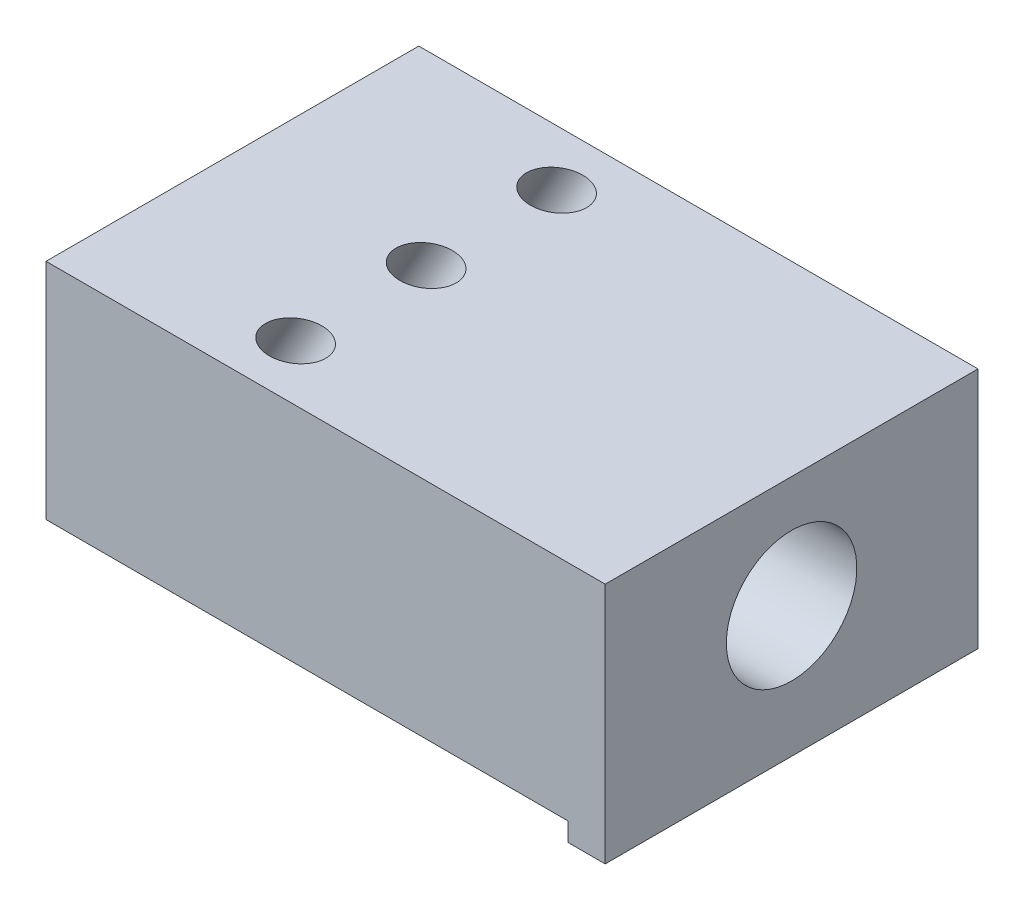
ISO-10303-21;
HEADER;
FILE_DESCRIPTION(('STEP AP214'),'2;1');
FILE_NAME('part.step','',(''),(''),'','','');
FILE_SCHEMA(('AUTOMOTIVE_DESIGN { 1 0 10303 214 1 1 1 1 }'));
ENDSEC;
DATA;
#1=APPLICATION_CONTEXT('core data for automotive mechanical design processes');
#2=APPLICATION_PROTOCOL_DEFINITION('international standard','automotive_design',2000,#1);
#3=PRODUCT_CONTEXT('',#1,'mechanical');
#4=PRODUCT('Part','Part','',(#3));
#5=PRODUCT_RELATED_PRODUCT_CATEGORY('part','',(#4));
#6=PRODUCT_DEFINITION_FORMATION('','',#4);
#7=PRODUCT_DEFINITION_CONTEXT('part definition',#1,'design');
#8=PRODUCT_DEFINITION('design','',#6,#7);
#9=PRODUCT_DEFINITION_SHAPE('','',#8);
#10=(LENGTH_UNIT() NAMED_UNIT(*) SI_UNIT(.MILLI.,.METRE.));
#11=(NAMED_UNIT(*) PLANE_ANGLE_UNIT() SI_UNIT($,.RADIAN.));
#12=(NAMED_UNIT(*) SI_UNIT($,.STERADIAN.) SOLID_ANGLE_UNIT());
#13=UNCERTAINTY_MEASURE_WITH_UNIT(LENGTH_MEASURE(1.E-05),#10,'distance_accuracy_value','');
#14=(GEOMETRIC_REPRESENTATION_CONTEXT(3) GLOBAL_UNCERTAINTY_ASSIGNED_CONTEXT((#13)) GLOBAL_UNIT_ASSIGNED_CONTEXT((#10,
#11,#12)) REPRESENTATION_CONTEXT('',''));
#15=CARTESIAN_POINT('',(0.,0.,0.));
#16=DIRECTION('',(0.,0.,1.));
#17=DIRECTION('',(1.,0.,0.));
#18=AXIS2_PLACEMENT_3D('',#15,#16,#17);
#19=CARTESIAN_POINT('',(0.,0.,20.));
#20=DIRECTION('',(0.,1.,0.));
#21=DIRECTION('',(-1.,0.,0.));
#22=AXIS2_PLACEMENT_3D('',#19,#20,#21);
#23=PLANE('',#22);
#24=CARTESIAN_POINT('',(3.46410161513776,0.,3.));
#25=DIRECTION('',(0.,1.,0.));
#26=DIRECTION('',(-1.,0.,0.));
#27=AXIS2_PLACEMENT_3D('',#24,#25,#26);
#28=ELLIPSE('',#27,1.61658075373095,1.4);
#29=CARTESIAN_POINT('',(1.84752086140681,0.,3.));
#30=VERTEX_POINT('',#29);
#31=EDGE_CURVE('E216',#30,#30,#28,.T.);
#32=ORIENTED_EDGE('',*,*,#31,.T.);
#33=EDGE_LOOP('',(#32));
#34=FACE_BOUND('',#33,.T.);
#35=CARTESIAN_POINT('',(3.46410161513776,0.,17.));
#36=DIRECTION('',(0.,1.,0.));
#37=DIRECTION('',(-1.,0.,0.));
#38=AXIS2_PLACEMENT_3D('',#35,#36,#37);
#39=ELLIPSE('',#38,1.61658075373095,1.4);
#40=CARTESIAN_POINT('',(1.84752086140681,0.,17.));
#41=VERTEX_POINT('',#40);
#42=EDGE_CURVE('E220',#41,#41,#39,.T.);
#43=ORIENTED_EDGE('',*,*,#42,.T.);
#44=EDGE_LOOP('',(#43));
#45=FACE_BOUND('',#44,.T.);
#46=CARTESIAN_POINT('',(3.46410161513776,0.,10.));
#47=DIRECTION('',(0.,1.,0.));
#48=DIRECTION('',(-1.,0.,0.));
#49=AXIS2_PLACEMENT_3D('',#46,#47,#48);
#50=ELLIPSE('',#49,1.61658075373095,1.4);
#51=CARTESIAN_POINT('',(1.8475208614068,0.,10.));
#52=VERTEX_POINT('',#51);
#53=EDGE_CURVE('E223',#52,#52,#50,.T.);
#54=ORIENTED_EDGE('',*,*,#53,.T.);
#55=EDGE_LOOP('',(#54));
#56=FACE_BOUND('',#55,.T.);
#57=DIRECTION('',(1.,0.,0.));
#58=VECTOR('',#57,1.);
#59=CARTESIAN_POINT('',(0.,0.,0.));
#60=LINE('',#59,#58);
#61=CARTESIAN_POINT('',(0.,0.,0.));
#62=VERTEX_POINT('',#61);
#63=CARTESIAN_POINT('',(28.,0.,0.));
#64=VERTEX_POINT('',#63);
#65=EDGE_CURVE('E138',#62,#64,#60,.T.);
#66=ORIENTED_EDGE('',*,*,#65,.T.);
#67=DIRECTION('',(0.,0.,-1.));
#68=VECTOR('',#67,1.);
#69=CARTESIAN_POINT('',(28.,0.,20.));
#70=LINE('',#69,#68);
#71=CARTESIAN_POINT('',(28.,0.,20.));
#72=VERTEX_POINT('',#71);
#73=EDGE_CURVE('E11',#72,#64,#70,.T.);
#74=ORIENTED_EDGE('',*,*,#73,.F.);
#75=DIRECTION('',(1.,0.,0.));
#76=VECTOR('',#75,1.);
#77=CARTESIAN_POINT('',(0.,0.,20.));
#78=LINE('',#77,#76);
#79=CARTESIAN_POINT('',(0.,0.,20.));
#80=VERTEX_POINT('',#79);
#81=EDGE_CURVE('E159',#80,#72,#78,.T.);
#82=ORIENTED_EDGE('',*,*,#81,.F.);
#83=DIRECTION('',(0.,0.,-1.));
#84=VECTOR('',#83,1.);
#85=CARTESIAN_POINT('',(0.,0.,20.));
#86=LINE('',#85,#84);
#87=EDGE_CURVE('E66',#80,#62,#86,.T.);
#88=ORIENTED_EDGE('',*,*,#87,.T.);
#89=EDGE_LOOP('',(#66,#74,#82,#88));
#90=FACE_BOUND('',#89,.T.);
#91=ADVANCED_FACE('F47',(#34,#45,#56,#90),#23,.F.);
#92=CARTESIAN_POINT('',(28.,0.,20.));
#93=DIRECTION('',(1.,0.,0.));
#94=DIRECTION('',(0.,0.,-1.));
#95=AXIS2_PLACEMENT_3D('',#92,#93,#94);
#96=PLANE('',#95);
#97=DIRECTION('',(0.,-1.,0.));
#98=VECTOR('',#97,1.);
#99=CARTESIAN_POINT('',(28.,0.,0.));
#100=LINE('',#99,#98);
#101=CARTESIAN_POINT('',(28.,-0.999999999999999,0.));
#102=VERTEX_POINT('',#101);
#103=EDGE_CURVE('E141',#64,#102,#100,.T.);
#104=ORIENTED_EDGE('',*,*,#103,.T.);
#105=DIRECTION('',(0.,0.,-1.));
#106=VECTOR('',#105,1.);
#107=CARTESIAN_POINT('',(28.,-0.999999999999999,20.));
#108=LINE('',#107,#106);
#109=CARTESIAN_POINT('',(28.,-0.999999999999999,20.));
#110=VERTEX_POINT('',#109);
#111=EDGE_CURVE('E57',#110,#102,#108,.T.);
#112=ORIENTED_EDGE('',*,*,#111,.F.);
#113=DIRECTION('',(0.,-1.,0.));
#114=VECTOR('',#113,1.);
#115=CARTESIAN_POINT('',(28.,0.,20.));
#116=LINE('',#115,#114);
#117=EDGE_CURVE('E98',#72,#110,#116,.T.);
#118=ORIENTED_EDGE('',*,*,#117,.F.);
#119=ORIENTED_EDGE('',*,*,#73,.T.);
#120=EDGE_LOOP('',(#104,#112,#118,#119));
#121=FACE_BOUND('',#120,.T.);
#122=ADVANCED_FACE('F205',(#121),#96,.F.);
#123=CARTESIAN_POINT('',(0.,-1.00000000000001,20.));
#124=DIRECTION('',(0.,-1.,0.));
#125=DIRECTION('',(1.,0.,0.));
#126=AXIS2_PLACEMENT_3D('',#123,#124,#125);
#127=PLANE('',#126);
#128=DIRECTION('',(-1.,0.,0.));
#129=VECTOR('',#128,1.);
#130=CARTESIAN_POINT('',(0.,-1.00000000000001,0.));
#131=LINE('',#130,#129);
#132=CARTESIAN_POINT('',(30.,-0.999999999999999,0.));
#133=VERTEX_POINT('',#132);
#134=EDGE_CURVE('E146',#133,#102,#131,.T.);
#135=ORIENTED_EDGE('',*,*,#134,.F.);
#136=DIRECTION('',(0.,0.,-1.));
#137=VECTOR('',#136,1.);
#138=CARTESIAN_POINT('',(30.,-0.999999999999999,20.));
#139=LINE('',#138,#137);
#140=CARTESIAN_POINT('',(30.,-0.999999999999999,20.));
#141=VERTEX_POINT('',#140);
#142=EDGE_CURVE('E128',#141,#133,#139,.T.);
#143=ORIENTED_EDGE('',*,*,#142,.F.);
#144=DIRECTION('',(-1.,0.,0.));
#145=VECTOR('',#144,1.);
#146=CARTESIAN_POINT('',(0.,-1.00000000000001,20.));
#147=LINE('',#146,#145);
#148=EDGE_CURVE('E116',#141,#110,#147,.T.);
#149=ORIENTED_EDGE('',*,*,#148,.T.);
#150=ORIENTED_EDGE('',*,*,#111,.T.);
#151=EDGE_LOOP('',(#135,#143,#149,#150));
#152=FACE_BOUND('',#151,.T.);
#153=ADVANCED_FACE('F212',(#152),#127,.T.);
#154=CARTESIAN_POINT('',(30.,0.,20.));
#155=DIRECTION('',(-1.,0.,0.));
#156=DIRECTION('',(0.,0.,1.));
#157=AXIS2_PLACEMENT_3D('',#154,#155,#156);
#158=PLANE('',#157);
#159=CARTESIAN_POINT('',(30.,6.,10.));
#160=DIRECTION('',(-1.,0.,0.));
#161=DIRECTION('',(0.,0.,1.));
#162=AXIS2_PLACEMENT_3D('',#159,#160,#161);
#163=CIRCLE('',#162,3.5);
#164=CARTESIAN_POINT('',(30.,6.,13.5));
#165=VERTEX_POINT('',#164);
#166=EDGE_CURVE('E142',#165,#165,#163,.T.);
#167=ORIENTED_EDGE('',*,*,#166,.T.);
#168=EDGE_LOOP('',(#167));
#169=FACE_BOUND('',#168,.T.);
#170=DIRECTION('',(0.,1.,0.));
#171=VECTOR('',#170,1.);
#172=CARTESIAN_POINT('',(30.,0.,0.));
#173=LINE('',#172,#171);
#174=CARTESIAN_POINT('',(30.,12.,0.));
#175=VERTEX_POINT('',#174);
#176=EDGE_CURVE('E124',#133,#175,#173,.T.);
#177=ORIENTED_EDGE('',*,*,#176,.T.);
#178=DIRECTION('',(0.,0.,-1.));
#179=VECTOR('',#178,1.);
#180=CARTESIAN_POINT('',(30.,12.,20.));
#181=LINE('',#180,#179);
#182=CARTESIAN_POINT('',(30.,12.,20.));
#183=VERTEX_POINT('',#182);
#184=EDGE_CURVE('E121',#183,#175,#181,.T.);
#185=ORIENTED_EDGE('',*,*,#184,.F.);
#186=DIRECTION('',(0.,1.,0.));
#187=VECTOR('',#186,1.);
#188=CARTESIAN_POINT('',(30.,0.,20.));
#189=LINE('',#188,#187);
#190=EDGE_CURVE('E109',#141,#183,#189,.T.);
#191=ORIENTED_EDGE('',*,*,#190,.F.);
#192=ORIENTED_EDGE('',*,*,#142,.T.);
#193=EDGE_LOOP('',(#177,#185,#191,#192));
#194=FACE_BOUND('',#193,.T.);
#195=ADVANCED_FACE('F122',(#169,#194),#158,.F.);
#196=CARTESIAN_POINT('',(0.,12.,20.));
#197=DIRECTION('',(0.,1.,0.));
#198=DIRECTION('',(0.,0.,1.));
#199=AXIS2_PLACEMENT_3D('',#196,#197,#198);
#200=PLANE('',#199);
#201=CARTESIAN_POINT('',(10.3923048454133,12.,3.));
#202=DIRECTION('',(0.,1.,0.));
#203=DIRECTION('',(-1.,0.,0.));
#204=AXIS2_PLACEMENT_3D('',#201,#202,#203);
#205=ELLIPSE('',#204,1.61658075373095,1.4);
#206=CARTESIAN_POINT('',(8.77572409168233,12.,3.));
#207=VERTEX_POINT('',#206);
#208=EDGE_CURVE('E50',#207,#207,#205,.T.);
#209=ORIENTED_EDGE('',*,*,#208,.F.);
#210=EDGE_LOOP('',(#209));
#211=FACE_BOUND('',#210,.T.);
#212=CARTESIAN_POINT('',(10.3923048454133,12.,17.));
#213=DIRECTION('',(0.,1.,0.));
#214=DIRECTION('',(-1.,0.,0.));
#215=AXIS2_PLACEMENT_3D('',#212,#213,#214);
#216=ELLIPSE('',#215,1.61658075373095,1.4);
#217=CARTESIAN_POINT('',(8.77572409168233,12.,17.));
#218=VERTEX_POINT('',#217);
#219=EDGE_CURVE('E263',#218,#218,#216,.T.);
#220=ORIENTED_EDGE('',*,*,#219,.F.);
#221=EDGE_LOOP('',(#220));
#222=FACE_BOUND('',#221,.T.);
#223=CARTESIAN_POINT('',(10.3923048454133,12.,10.));
#224=DIRECTION('',(0.,1.,0.));
#225=DIRECTION('',(-1.,0.,0.));
#226=AXIS2_PLACEMENT_3D('',#223,#224,#225);
#227=ELLIPSE('',#226,1.61658075373095,1.4);
#228=CARTESIAN_POINT('',(8.77572409168233,12.,10.));
#229=VERTEX_POINT('',#228);
#230=EDGE_CURVE('E266',#229,#229,#227,.T.);
#231=ORIENTED_EDGE('',*,*,#230,.F.);
#232=EDGE_LOOP('',(#231));
#233=FACE_BOUND('',#232,.T.);
#234=DIRECTION('',(1.,0.,0.));
#235=VECTOR('',#234,1.);
#236=CARTESIAN_POINT('',(0.,12.,0.));
#237=LINE('',#236,#235);
#238=CARTESIAN_POINT('',(0.,12.,0.));
#239=VERTEX_POINT('',#238);
#240=EDGE_CURVE('E152',#239,#175,#237,.T.);
#241=ORIENTED_EDGE('',*,*,#240,.F.);
#242=DIRECTION('',(0.,0.,-1.));
#243=VECTOR('',#242,1.);
#244=CARTESIAN_POINT('',(0.,12.,20.));
#245=LINE('',#244,#243);
#246=CARTESIAN_POINT('',(0.,12.,20.));
#247=VERTEX_POINT('',#246);
#248=EDGE_CURVE('E86',#247,#239,#245,.T.);
#249=ORIENTED_EDGE('',*,*,#248,.F.);
#250=DIRECTION('',(1.,0.,0.));
#251=VECTOR('',#250,1.);
#252=CARTESIAN_POINT('',(0.,12.,20.));
#253=LINE('',#252,#251);
#254=EDGE_CURVE('E114',#247,#183,#253,.T.);
#255=ORIENTED_EDGE('',*,*,#254,.T.);
#256=ORIENTED_EDGE('',*,*,#184,.T.);
#257=EDGE_LOOP('',(#241,#249,#255,#256));
#258=FACE_BOUND('',#257,.T.);
#259=ADVANCED_FACE('F130',(#211,#222,#233,#258),#200,.T.);
#260=CARTESIAN_POINT('',(0.,0.,20.));
#261=DIRECTION('',(-1.,0.,0.));
#262=DIRECTION('',(0.,0.,1.));
#263=AXIS2_PLACEMENT_3D('',#260,#261,#262);
#264=PLANE('',#263);
#265=CARTESIAN_POINT('',(0.,6.,10.));
#266=DIRECTION('',(-1.,0.,0.));
#267=DIRECTION('',(0.,0.,1.));
#268=AXIS2_PLACEMENT_3D('',#265,#266,#267);
#269=CIRCLE('',#268,3.5);
#270=CARTESIAN_POINT('',(0.,6.,13.5));
#271=VERTEX_POINT('',#270);
#272=EDGE_CURVE('E255',#271,#271,#269,.T.);
#273=ORIENTED_EDGE('',*,*,#272,.F.);
#274=EDGE_LOOP('',(#273));
#275=FACE_BOUND('',#274,.T.);
#276=DIRECTION('',(0.,1.,0.));
#277=VECTOR('',#276,1.);
#278=CARTESIAN_POINT('',(0.,0.,0.));
#279=LINE('',#278,#277);
#280=EDGE_CURVE('E155',#62,#239,#279,.T.);
#281=ORIENTED_EDGE('',*,*,#280,.F.);
#282=ORIENTED_EDGE('',*,*,#87,.F.);
#283=DIRECTION('',(0.,1.,0.));
#284=VECTOR('',#283,1.);
#285=CARTESIAN_POINT('',(0.,0.,20.));
#286=LINE('',#285,#284);
#287=EDGE_CURVE('E132',#80,#247,#286,.T.);
#288=ORIENTED_EDGE('',*,*,#287,.T.);
#289=ORIENTED_EDGE('',*,*,#248,.T.);
#290=EDGE_LOOP('',(#281,#282,#288,#289));
#291=FACE_BOUND('',#290,.T.);
#292=ADVANCED_FACE('F227',(#275,#291),#264,.T.);
#293=CARTESIAN_POINT('',(0.,0.,20.));
#294=DIRECTION('',(0.,0.,1.));
#295=DIRECTION('',(1.,0.,0.));
#296=AXIS2_PLACEMENT_3D('',#293,#294,#295);
#297=PLANE('',#296);
#298=ORIENTED_EDGE('',*,*,#81,.T.);
#299=ORIENTED_EDGE('',*,*,#117,.T.);
#300=ORIENTED_EDGE('',*,*,#148,.F.);
#301=ORIENTED_EDGE('',*,*,#190,.T.);
#302=ORIENTED_EDGE('',*,*,#254,.F.);
#303=ORIENTED_EDGE('',*,*,#287,.F.);
#304=EDGE_LOOP('',(#298,#299,#300,#301,#302,#303));
#305=FACE_BOUND('',#304,.T.);
#306=ADVANCED_FACE('F111',(#305),#297,.T.);
#307=CARTESIAN_POINT('',(0.,0.,0.));
#308=DIRECTION('',(0.,0.,1.));
#309=DIRECTION('',(1.,0.,0.));
#310=AXIS2_PLACEMENT_3D('',#307,#308,#309);
#311=PLANE('',#310);
#312=ORIENTED_EDGE('',*,*,#65,.F.);
#313=ORIENTED_EDGE('',*,*,#280,.T.);
#314=ORIENTED_EDGE('',*,*,#240,.T.);
#315=ORIENTED_EDGE('',*,*,#176,.F.);
#316=ORIENTED_EDGE('',*,*,#134,.T.);
#317=ORIENTED_EDGE('',*,*,#103,.F.);
#318=EDGE_LOOP('',(#312,#313,#314,#315,#316,#317));
#319=FACE_BOUND('',#318,.T.);
#320=ADVANCED_FACE('F226',(#319),#311,.F.);
#321=CARTESIAN_POINT('',(34.,6.,10.));
#322=DIRECTION('',(-1.,0.,0.));
#323=DIRECTION('',(0.,0.,1.));
#324=AXIS2_PLACEMENT_3D('',#321,#322,#323);
#325=CYLINDRICAL_SURFACE('',#324,3.5);
#326=CARTESIAN_POINT('',(10.5655099261702,9.5,10.));
#327=CARTESIAN_POINT('',(10.5655019804989,9.49999707691454,9.93733608390405));
#328=CARTESIAN_POINT('',(10.5596140304328,9.49829245487332,9.87456554597497));
#329=CARTESIAN_POINT('',(10.536622066298,9.49169793448986,9.7512226083709));
#330=CARTESIAN_POINT('',(10.5194880887418,9.4867995269791,9.69065653847818));
#331=CARTESIAN_POINT('',(10.4756908630487,9.47447220993095,9.57402313240613));
#332=CARTESIAN_POINT('',(10.4491124292871,9.46706584964382,9.51792102692038));
#333=CARTESIAN_POINT('',(10.3881398335939,9.45043012704379,9.41051496610449));
#334=CARTESIAN_POINT('',(10.3537443126028,9.4412004477697,9.35921184730624));
#335=CARTESIAN_POINT('',(10.2608605782599,9.41694559628654,9.238505901837));
#336=CARTESIAN_POINT('',(10.1986871986898,9.40124944779828,9.17207517057786));
#337=CARTESIAN_POINT('',(10.0645236359055,9.36923699341127,9.05014154586345));
#338=CARTESIAN_POINT('',(9.99250985441127,9.3529192668952,8.99466573009));
#339=CARTESIAN_POINT('',(9.82104942927556,9.31695046684834,8.88094330012037));
#340=CARTESIAN_POINT('',(9.71941123174704,9.29757228804518,8.82590982130002));
#341=CARTESIAN_POINT('',(9.5079387415794,9.26291525403439,8.73277839943558));
#342=CARTESIAN_POINT('',(9.39809637468366,9.24764050707079,8.69469740388303));
#343=CARTESIAN_POINT('',(9.17240867860238,9.22362181307443,8.63645189883026));
#344=CARTESIAN_POINT('',(9.05653673599412,9.21491001180229,8.61637548690453));
#345=CARTESIAN_POINT('',(8.82282256379757,9.20651308963459,8.59699122939424));
#346=CARTESIAN_POINT('',(8.7049873748184,9.20680067494495,8.59762058660555));
#347=CARTESIAN_POINT('',(8.50809962866394,9.21594718705051,8.61879180917361));
#348=CARTESIAN_POINT('',(8.42824805708896,9.22214724133223,8.63316036884921));
#349=CARTESIAN_POINT('',(8.27224601294843,9.23921929749989,8.6741193638523));
#350=CARTESIAN_POINT('',(8.19609292884146,9.25008794784208,8.70070103244846));
#351=CARTESIAN_POINT('',(8.04969743503839,9.27560187846094,8.76644045987196));
#352=CARTESIAN_POINT('',(7.9794800509224,9.2902621843791,8.80564840945311));
#353=CARTESIAN_POINT('',(7.84768877750157,9.3216620844851,8.89599185793093));
#354=CARTESIAN_POINT('',(7.78611559261073,9.33840184791823,8.94712832797757));
#355=CARTESIAN_POINT('',(7.67725312515995,9.37077350726374,9.056128746529));
#356=CARTESIAN_POINT('',(7.62928622595544,9.38640504359584,9.1133191147374));
#357=CARTESIAN_POINT('',(7.54354146567577,9.41600680814272,9.235259376319));
#358=CARTESIAN_POINT('',(7.5057631933753,9.42997710339447,9.30000896444173));
#359=CARTESIAN_POINT('',(7.44087550095543,9.45488393246493,9.43559845166316));
#360=CARTESIAN_POINT('',(7.41382138983383,9.46580465508763,9.50646768557108));
#361=CARTESIAN_POINT('',(7.37103066154714,9.48343246470343,9.65204348324753));
#362=CARTESIAN_POINT('',(7.3552949320655,9.49013922119636,9.72675034750337));
#363=CARTESIAN_POINT('',(7.33515247682352,9.49876869526363,9.87933604058973));
#364=CARTESIAN_POINT('',(7.33095675863094,9.50060228764715,9.95724783826084));
#365=CARTESIAN_POINT('',(7.33454837802605,9.49904776594307,10.1127459288225));
#366=CARTESIAN_POINT('',(7.34233649371246,9.49565931279308,10.190332200249));
#367=CARTESIAN_POINT('',(7.36987631428135,9.48396392070361,10.3433902715172));
#368=CARTESIAN_POINT('',(7.38968964333005,9.47563165174393,10.418849070512));
#369=CARTESIAN_POINT('',(7.44107366081294,9.45487516700797,10.5650590732302));
#370=CARTESIAN_POINT('',(7.47264423405059,9.44245099132399,10.6358103230698));
#371=CARTESIAN_POINT('',(7.54682200197881,9.41490800965441,10.7701155833918));
#372=CARTESIAN_POINT('',(7.58936028100592,9.39980620726841,10.8337110958091));
#373=CARTESIAN_POINT('',(7.68473268404676,9.3685083066336,10.9523232388396));
#374=CARTESIAN_POINT('',(7.73756411083088,9.35231249578493,11.0073421101026));
#375=CARTESIAN_POINT('',(7.85111962443758,9.3209552217178,11.1063037013803));
#376=CARTESIAN_POINT('',(7.91167086430693,9.30577979391461,11.1504404530499));
#377=CARTESIAN_POINT('',(8.039726913703,9.27774927931109,11.2280348862797));
#378=CARTESIAN_POINT('',(8.10723082302102,9.2648938927112,11.2614939480587));
#379=CARTESIAN_POINT('',(8.24710230958823,9.24273985038588,11.3174017568972));
#380=CARTESIAN_POINT('',(8.31946592227717,9.23343833586646,11.3398593578363));
#381=CARTESIAN_POINT('',(8.46705638190022,9.2190244101699,11.3741274748813));
#382=CARTESIAN_POINT('',(8.54228440185979,9.2139137349496,11.3859335790573));
#383=CARTESIAN_POINT('',(8.7005041814523,9.20771502702961,11.4002259426763));
#384=CARTESIAN_POINT('',(8.78359196671805,9.20702467081571,11.401791119406));
#385=CARTESIAN_POINT('',(8.94915302676631,9.21029617856591,11.3942763171709));
#386=CARTESIAN_POINT('',(9.0316260546144,9.214259820238,11.3851922704776));
#387=CARTESIAN_POINT('',(9.21012210472689,9.22723430998893,11.3547280643513));
#388=CARTESIAN_POINT('',(9.30574243851447,9.23706102212689,11.3313396217759));
#389=CARTESIAN_POINT('',(9.49260130905351,9.26084157219426,11.2719778472055));
#390=CARTESIAN_POINT('',(9.58383105641758,9.27480331850849,11.2359803757171));
#391=CARTESIAN_POINT('',(9.77578682163785,9.30805236167583,11.1443727246919));
#392=CARTESIAN_POINT('',(9.87531651431839,9.32784518243463,11.0864131711125));
#393=CARTESIAN_POINT('',(10.0619913138042,9.36835944455243,10.9534014361758));
#394=CARTESIAN_POINT('',(10.149166989659,9.38907842079214,10.8783926845246));
#395=CARTESIAN_POINT('',(10.2742812540569,9.42041817216405,10.7439302080887));
#396=CARTESIAN_POINT('',(10.3180525109857,9.43179046452115,10.6900674719424));
#397=CARTESIAN_POINT('',(10.3969276444637,9.45276557244061,10.5759847434179));
#398=CARTESIAN_POINT('',(10.4320432134355,9.46237077055799,10.5157734856872));
#399=CARTESIAN_POINT('',(10.486253375404,9.47741871622389,10.4004341751231));
#400=CARTESIAN_POINT('',(10.507052559421,9.48329057985034,10.3461666876377));
#401=CARTESIAN_POINT('',(10.5396504653709,9.49255560210019,10.2348411998595));
#402=CARTESIAN_POINT('',(10.5514719998226,9.49595504229994,10.1777906670717));
#403=CARTESIAN_POINT('',(10.5607316663653,9.4986216564822,10.10024241238));
#404=CARTESIAN_POINT('',(10.5625201916556,9.49913731067061,10.0802438388192));
#405=CARTESIAN_POINT('',(10.5649107075375,9.49982698332599,10.0401671723912));
#406=CARTESIAN_POINT('',(10.5655124734273,9.50000093709519,10.020089065186));
#407=CARTESIAN_POINT('',(10.5655099261702,9.5,10.));
#408=B_SPLINE_CURVE_WITH_KNOTS('',3,(#326,#327,#328,#329,#330,#331,#332,#333,#334,#335,#336,
#337,#338,#339,#340,#341,#342,#343,#344,#345,#346,#347,#348,#349,#350,#351,#352,#353,#354,#355,
#356,#357,#358,#359,#360,#361,#362,#363,#364,#365,#366,#367,#368,#369,#370,#371,#372,#373,#374,
#375,#376,#377,#378,#379,#380,#381,#382,#383,#384,#385,#386,#387,#388,#389,#390,#391,#392,#393,
#394,#395,#396,#397,#398,#399,#400,#401,#402,#403,#404,#405,#406,#407),.UNSPECIFIED.,.T.,.F.,(4,
2,2,2,2,2,2,2,2,2,2,2,2,2,2,2,2,2,2,2,2,2,2,2,2,2,2,2,2,2,2,2,2,2,2,2,2,2,2,2,4),(0.,
0.187895588179173,0.376293841546494,0.563041282608513,0.749821215989422,1.0252861898634,
1.30142374519096,1.65127072472387,2.00146666709419,2.35336693625072,2.70420004823192,
2.9473127145219,3.19025114330428,3.43416745095229,3.6781036237664,3.9058168740593,
4.13352093219385,4.36238453499259,4.59126608525887,4.82430572931717,5.0573605050523,
5.29161979306411,5.52587678588265,5.7586962484755,5.9914547846142,6.21970141738004,
6.44791853458705,6.67595168167578,6.90407923849855,7.15247219871344,7.40096006955089,
7.69665939420876,7.99292794598053,8.34188247945258,8.68995788399805,8.90028907959,
9.11033457550455,9.28488330099797,9.45898699421805,9.51921196042719,9.57944832856794),.UNSPECIFIED.);
#409=CARTESIAN_POINT('',(10.5655099261702,9.5,10.));
#410=VERTEX_POINT('',#409);
#411=EDGE_CURVE('E177',#410,#410,#408,.T.);
#412=ORIENTED_EDGE('',*,*,#411,.T.);
#413=EDGE_LOOP('',(#412));
#414=FACE_BOUND('',#413,.T.);
#415=CARTESIAN_POINT('',(6.52405804184278,2.5,10.));
#416=CARTESIAN_POINT('',(6.52405611801225,2.50000305374846,10.0777935423338));
#417=CARTESIAN_POINT('',(6.51805776541043,2.50261778264391,10.1556340014027));
#418=CARTESIAN_POINT('',(6.49411766145898,2.5128315260921,10.3091795824947));
#419=CARTESIAN_POINT('',(6.47616367127129,2.52043564810773,10.3848824334089));
#420=CARTESIAN_POINT('',(6.4285302248944,2.53986529287947,10.5319474146223));
#421=CARTESIAN_POINT('',(6.39885032477205,2.5516909754587,10.6033093804611));
#422=CARTESIAN_POINT('',(6.32821753552112,2.578329187555,10.7395893637339));
#423=CARTESIAN_POINT('',(6.28726798044542,2.5931408333485,10.8045092792896));
#424=CARTESIAN_POINT('',(6.19529833586359,2.62399295773029,10.9254404942345));
#425=CARTESIAN_POINT('',(6.14437721413562,2.64002048104967,10.9815302847547));
#426=CARTESIAN_POINT('',(6.03342140666705,2.67164644359497,11.0839480299598));
#427=CARTESIAN_POINT('',(5.97338910673237,2.68724499389019,11.1302785325994));
#428=CARTESIAN_POINT('',(5.84711220385897,2.71602068569065,11.2113227631908));
#429=CARTESIAN_POINT('',(5.78100755911933,2.72923825728511,11.2462407777849));
#430=CARTESIAN_POINT('',(5.64360698958858,2.75233258449893,11.3052453206509));
#431=CARTESIAN_POINT('',(5.57231047244135,2.76220895818308,11.3293306107283));
#432=CARTESIAN_POINT('',(5.42445725657976,2.77810924605373,11.3674288588042));
#433=CARTESIAN_POINT('',(5.34780784840794,2.78401263928747,11.381128184178));
#434=CARTESIAN_POINT('',(5.19317521114024,2.79132051266692,11.3980184281072));
#435=CARTESIAN_POINT('',(5.11519141885067,2.79272304360483,11.4012047937866));
#436=CARTESIAN_POINT('',(4.94883947068655,2.79122422562456,11.3977714758986));
#437=CARTESIAN_POINT('',(4.86050881606199,2.787708426322,11.389751987493));
#438=CARTESIAN_POINT('',(4.68587810455112,2.77608964632583,11.362575161804));
#439=CARTESIAN_POINT('',(4.59957996676061,2.76798249816952,11.3434077053374));
#440=CARTESIAN_POINT('',(4.41277907469298,2.74615817483507,11.28977689583));
#441=CARTESIAN_POINT('',(4.31304254751088,2.73162618930264,11.2529655992556));
#442=CARTESIAN_POINT('',(4.12055648492298,2.69927847245125,11.165088667771));
#443=CARTESIAN_POINT('',(4.02780971227924,2.68146145218378,11.1140174336316));
#444=CARTESIAN_POINT('',(3.86564245682953,2.64745102340045,11.0065203468516));
#445=CARTESIAN_POINT('',(3.79483193547257,2.63143205237081,10.9521408047721));
#446=CARTESIAN_POINT('',(3.66264201155836,2.59995764128925,10.8327722330477));
#447=CARTESIAN_POINT('',(3.60124594483734,2.58450124332786,10.7678023796246));
#448=CARTESIAN_POINT('',(3.50591854584552,2.55967680956043,10.6457271891696));
#449=CARTESIAN_POINT('',(3.46901326774236,2.54977772364128,10.5910613349193));
#450=CARTESIAN_POINT('',(3.40417529261073,2.5320789384515,10.4763152614366));
#451=CARTESIAN_POINT('',(3.37623027925389,2.52427635983993,10.4162426209246));
#452=CARTESIAN_POINT('',(3.33470032192586,2.51256405835238,10.3010406404556));
#453=CARTESIAN_POINT('',(3.31959839033324,2.50824811123763,10.2465035931416));
#454=CARTESIAN_POINT('',(3.298458659674,2.50218605523304,10.1355559176957));
#455=CARTESIAN_POINT('',(3.29241535817581,2.50043838632142,10.0791464482225));
#456=CARTESIAN_POINT('',(3.28988204757819,2.49970719664256,9.96599940715114));
#457=CARTESIAN_POINT('',(3.29340776951412,2.50072822748822,9.90926144847753));
#458=CARTESIAN_POINT('',(3.30974797851713,2.50542674257021,9.79725652030283));
#459=CARTESIAN_POINT('',(3.32256622343319,2.50910530149526,9.74199015528335));
#460=CARTESIAN_POINT('',(3.35629604096365,2.51866893741034,9.63505855439359));
#461=CARTESIAN_POINT('',(3.37709616218041,2.52452359551107,9.58335481173912));
#462=CARTESIAN_POINT('',(3.42557373568193,2.53794556938697,9.48355038232033));
#463=CARTESIAN_POINT('',(3.45325436974076,2.54551367737259,9.43545137593456));
#464=CARTESIAN_POINT('',(3.53052273718477,2.56619424761623,9.3187342964077));
#465=CARTESIAN_POINT('',(3.5839369800043,2.58011641768966,9.2527879497693));
#466=CARTESIAN_POINT('',(3.70055449484911,2.60914603191548,9.13047023247502));
#467=CARTESIAN_POINT('',(3.76378301891746,2.62425648257813,9.07412437114722));
#468=CARTESIAN_POINT('',(3.91915534053821,2.65917555425551,8.95406896720881));
#469=CARTESIAN_POINT('',(4.01403367392552,2.67892161244859,8.89388017061295));
#470=CARTESIAN_POINT('',(4.21273385570112,2.715535757206,8.78948292466433));
#471=CARTESIAN_POINT('',(4.31656564374377,2.73240058163678,8.74529252620423));
#472=CARTESIAN_POINT('',(4.53175927629648,2.7610821375121,8.67299621335764));
#473=CARTESIAN_POINT('',(4.64319448772998,2.77283805250209,8.64508279141652));
#474=CARTESIAN_POINT('',(4.86960827442085,2.78866655619043,8.60795944354055));
#475=CARTESIAN_POINT('',(4.98457841166733,2.79275618653486,8.59870802969562));
#476=CARTESIAN_POINT('',(5.18408313410026,2.79167472826825,8.60120464702853));
#477=CARTESIAN_POINT('',(5.26869037434147,2.7886514726263,8.6080807646934));
#478=CARTESIAN_POINT('',(5.43552852916088,2.77727299030032,8.63462491319806));
#479=CARTESIAN_POINT('',(5.51776129185524,2.76892203399601,8.65428269922631));
#480=CARTESIAN_POINT('',(5.67762221432961,2.7473585250647,8.70727416811974));
#481=CARTESIAN_POINT('',(5.7552205237008,2.7341177329607,8.74068742195327));
#482=CARTESIAN_POINT('',(5.90235392555867,2.70425580701313,8.82106357392437));
#483=CARTESIAN_POINT('',(5.97189068464409,2.6876353738209,8.86802366443878));
#484=CARTESIAN_POINT('',(6.09419188222237,2.65486841554429,8.96915981871483));
#485=CARTESIAN_POINT('',(6.14792697731814,2.6388306645958,9.02220382951589));
#486=CARTESIAN_POINT('',(6.24548055833377,2.6075546473253,9.13695705666248));
#487=CARTESIAN_POINT('',(6.2892977144192,2.59231648842577,9.19866743323137));
#488=CARTESIAN_POINT('',(6.36567855116543,2.56444828867624,9.32819567482203));
#489=CARTESIAN_POINT('',(6.39836827031757,2.55178973714392,9.39593336069001));
#490=CARTESIAN_POINT('',(6.45268333965167,2.53014222562869,9.53620210800736));
#491=CARTESIAN_POINT('',(6.47431884841153,2.52114989800732,9.60872869907746));
#492=CARTESIAN_POINT('',(6.50153495598531,2.5096847178408,9.73460594912385));
#493=CARTESIAN_POINT('',(6.50997514725229,2.50606888443192,9.78725636912566));
#494=CARTESIAN_POINT('',(6.5212374362285,2.50122544126034,9.89326381522951));
#495=CARTESIAN_POINT('',(6.52405936190625,2.4999979046274,9.94662086291816));
#496=CARTESIAN_POINT('',(6.52405804184278,2.5,10.));
#497=B_SPLINE_CURVE_WITH_KNOTS('',3,(#415,#416,#417,#418,#419,#420,#421,#422,#423,#424,#425,
#426,#427,#428,#429,#430,#431,#432,#433,#434,#435,#436,#437,#438,#439,#440,#441,#442,#443,#444,
#445,#446,#447,#448,#449,#450,#451,#452,#453,#454,#455,#456,#457,#458,#459,#460,#461,#462,#463,
#464,#465,#466,#467,#468,#469,#470,#471,#472,#473,#474,#475,#476,#477,#478,#479,#480,#481,#482,
#483,#484,#485,#486,#487,#488,#489,#490,#491,#492,#493,#494,#495,#496),.UNSPECIFIED.,.T.,.F.,(4,
2,2,2,2,2,2,2,2,2,2,2,2,2,2,2,2,2,2,2,2,2,2,2,2,2,2,2,2,2,2,2,2,2,2,2,2,2,2,2,4),(0.,
0.233188714871834,0.466616509866449,0.700053143089326,0.933420789729934,1.16458000635544,
1.39567879692836,1.62237983403815,1.84910677678919,2.08243408372648,2.31586242509728,
2.58119549384058,2.84676978624619,3.16742628847344,3.48820887542385,3.75943148039675,
4.03016832073226,4.22955800008934,4.42867242168971,4.5981931128885,4.76761079132259,
4.93730715327303,5.10707217787601,5.27454828449005,5.44210198208271,5.69865578033085,
5.95588097909076,6.2963731116413,6.63724823077214,6.98207682729146,7.3261379793594,
7.57994617414028,7.83355118596922,8.08864430844753,8.34368460003606,8.57413846049043,
8.8046232027818,9.03240291296271,9.2599729203552,9.41997374922885,9.57997947725803),.UNSPECIFIED.);
#498=CARTESIAN_POINT('',(6.52405804184278,2.5,10.));
#499=VERTEX_POINT('',#498);
#500=EDGE_CURVE('E168',#499,#499,#497,.T.);
#501=ORIENTED_EDGE('',*,*,#500,.T.);
#502=EDGE_LOOP('',(#501));
#503=FACE_BOUND('',#502,.T.);
#504=ORIENTED_EDGE('',*,*,#272,.T.);
#505=EDGE_LOOP('',(#504));
#506=FACE_BOUND('',#505,.T.);
#507=ORIENTED_EDGE('',*,*,#166,.F.);
#508=EDGE_LOOP('',(#507));
#509=FACE_BOUND('',#508,.T.);
#510=ADVANCED_FACE('F181',(#414,#503,#506,#509),#325,.F.);
#511=CARTESIAN_POINT('',(19.5980762113534,27.9448637286709,10.));
#512=DIRECTION('',(-0.500000000000001,-0.866025403784438,0.));
#513=DIRECTION('',(0.866025403784438,-0.500000000000001,0.));
#514=AXIS2_PLACEMENT_3D('',#511,#512,#513);
#515=CYLINDRICAL_SURFACE('',#514,1.4);
#516=ORIENTED_EDGE('',*,*,#500,.F.);
#517=EDGE_LOOP('',(#516));
#518=FACE_BOUND('',#517,.T.);
#519=ORIENTED_EDGE('',*,*,#53,.F.);
#520=EDGE_LOOP('',(#519));
#521=FACE_BOUND('',#520,.T.);
#522=ADVANCED_FACE('F184',(#518,#521),#515,.F.);
#523=ORIENTED_EDGE('',*,*,#230,.T.);
#524=EDGE_LOOP('',(#523));
#525=FACE_BOUND('',#524,.T.);
#526=ORIENTED_EDGE('',*,*,#411,.F.);
#527=EDGE_LOOP('',(#526));
#528=FACE_BOUND('',#527,.T.);
#529=ADVANCED_FACE('F188',(#525,#528),#515,.F.);
#530=CARTESIAN_POINT('',(19.5980762113534,27.9448637286709,17.));
#531=DIRECTION('',(-0.500000000000001,-0.866025403784438,0.));
#532=DIRECTION('',(0.866025403784438,-0.500000000000001,0.));
#533=AXIS2_PLACEMENT_3D('',#530,#531,#532);
#534=CYLINDRICAL_SURFACE('',#533,1.4);
#535=ORIENTED_EDGE('',*,*,#219,.T.);
#536=EDGE_LOOP('',(#535));
#537=FACE_BOUND('',#536,.T.);
#538=ORIENTED_EDGE('',*,*,#42,.F.);
#539=EDGE_LOOP('',(#538));
#540=FACE_BOUND('',#539,.T.);
#541=ADVANCED_FACE('F194',(#537,#540),#534,.F.);
#542=CARTESIAN_POINT('',(19.5980762113534,27.9448637286709,3.));
#543=DIRECTION('',(-0.500000000000001,-0.866025403784438,0.));
#544=DIRECTION('',(0.866025403784438,-0.500000000000001,0.));
#545=AXIS2_PLACEMENT_3D('',#542,#543,#544);
#546=CYLINDRICAL_SURFACE('',#545,1.4);
#547=ORIENTED_EDGE('',*,*,#208,.T.);
#548=EDGE_LOOP('',(#547));
#549=FACE_BOUND('',#548,.T.);
#550=ORIENTED_EDGE('',*,*,#31,.F.);
#551=EDGE_LOOP('',(#550));
#552=FACE_BOUND('',#551,.T.);
#553=ADVANCED_FACE('F190',(#549,#552),#546,.F.);
#554=CLOSED_SHELL('',(#91,#122,#153,#195,#259,#292,#306,#320,#510,#522,#529,#541,#553));
#555=MANIFOLD_SOLID_BREP('B2',#554);
#556=ADVANCED_BREP_SHAPE_REPRESENTATION('',(#18,#555),#14);
#557=SHAPE_DEFINITION_REPRESENTATION(#9,#556);
ENDSEC;
END-ISO-10303-21;
